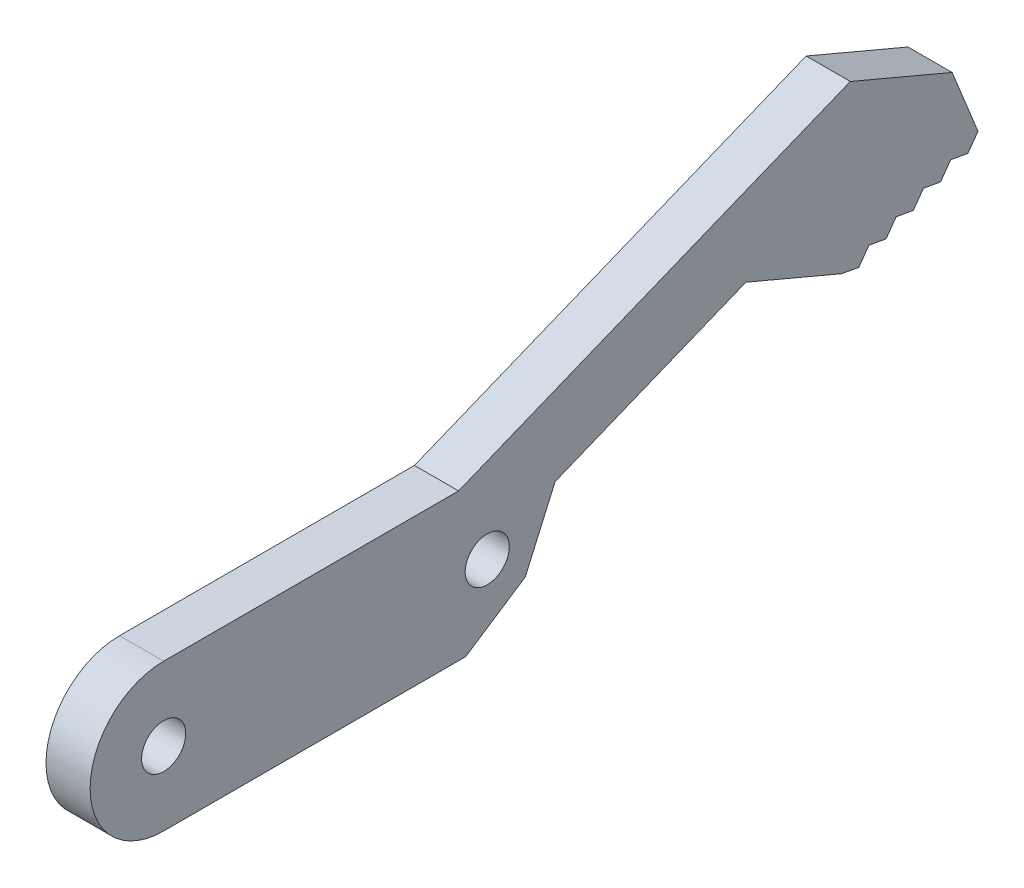
ISO-10303-21;
HEADER;
FILE_DESCRIPTION(('STEP AP214'),'2;1');
FILE_NAME('part.step','',(''),(''),'','','');
FILE_SCHEMA(('AUTOMOTIVE_DESIGN { 1 0 10303 214 1 1 1 1 }'));
ENDSEC;
DATA;
#1=APPLICATION_CONTEXT('core data for automotive mechanical design processes');
#2=APPLICATION_PROTOCOL_DEFINITION('international standard','automotive_design',2000,#1);
#3=PRODUCT_CONTEXT('',#1,'mechanical');
#4=PRODUCT('Part','Part','',(#3));
#5=PRODUCT_RELATED_PRODUCT_CATEGORY('part','',(#4));
#6=PRODUCT_DEFINITION_FORMATION('','',#4);
#7=PRODUCT_DEFINITION_CONTEXT('part definition',#1,'design');
#8=PRODUCT_DEFINITION('design','',#6,#7);
#9=PRODUCT_DEFINITION_SHAPE('','',#8);
#10=(LENGTH_UNIT() NAMED_UNIT(*) SI_UNIT(.MILLI.,.METRE.));
#11=(NAMED_UNIT(*) PLANE_ANGLE_UNIT() SI_UNIT($,.RADIAN.));
#12=(NAMED_UNIT(*) SI_UNIT($,.STERADIAN.) SOLID_ANGLE_UNIT());
#13=UNCERTAINTY_MEASURE_WITH_UNIT(LENGTH_MEASURE(1.E-05),#10,'distance_accuracy_value','');
#14=(GEOMETRIC_REPRESENTATION_CONTEXT(3) GLOBAL_UNCERTAINTY_ASSIGNED_CONTEXT((#13)) GLOBAL_UNIT_ASSIGNED_CONTEXT((#10,
#11,#12)) REPRESENTATION_CONTEXT('',''));
#15=CARTESIAN_POINT('',(0.,0.,0.));
#16=DIRECTION('',(0.,0.,1.));
#17=DIRECTION('',(1.,0.,0.));
#18=AXIS2_PLACEMENT_3D('',#15,#16,#17);
#19=CARTESIAN_POINT('',(2.83333333333333,5.43468723049841,-40.6850552661478));
#20=DIRECTION('',(1.,0.,0.));
#21=DIRECTION('',(0.,0.,-1.));
#22=AXIS2_PLACEMENT_3D('',#19,#20,#21);
#23=PLANE('',#22);
#24=CARTESIAN_POINT('',(2.83333333333333,5.43468723049841,-7.60184241572767));
#25=DIRECTION('',(1.,0.,0.));
#26=DIRECTION('',(0.,0.,-1.));
#27=AXIS2_PLACEMENT_3D('',#24,#25,#26);
#28=CIRCLE('',#27,1.33333333333333);
#29=CARTESIAN_POINT('',(2.83333333333333,5.43468723049841,-8.935175749061));
#30=VERTEX_POINT('',#29);
#31=EDGE_CURVE('E156',#30,#30,#28,.T.);
#32=ORIENTED_EDGE('',*,*,#31,.F.);
#33=EDGE_LOOP('',(#32));
#34=FACE_BOUND('',#33,.T.);
#35=CARTESIAN_POINT('',(2.83333333333333,5.43468723049841,-27.1573979712832));
#36=DIRECTION('',(1.,0.,0.));
#37=DIRECTION('',(0.,0.,-1.));
#38=AXIS2_PLACEMENT_3D('',#35,#36,#37);
#39=CIRCLE('',#38,1.33333333333333);
#40=CARTESIAN_POINT('',(2.83333333333333,5.43468723049841,-28.4907313046166));
#41=VERTEX_POINT('',#40);
#42=EDGE_CURVE('E127',#41,#41,#39,.T.);
#43=ORIENTED_EDGE('',*,*,#42,.F.);
#44=EDGE_LOOP('',(#43));
#45=FACE_BOUND('',#44,.T.);
#46=DIRECTION('',(0.,-0.17631045866029,-0.984334608843455));
#47=VECTOR('',#46,1.);
#48=CARTESIAN_POINT('',(2.83333333333333,21.0126260508792,-6.74373491928631));
#49=LINE('',#48,#47);
#50=CARTESIAN_POINT('',(2.83333333333333,12.339068917895,-55.1678756801447));
#51=VERTEX_POINT('',#50);
#52=CARTESIAN_POINT('',(2.83333333333333,12.1538402465791,-56.20200033226));
#53=VERTEX_POINT('',#52);
#54=EDGE_CURVE('E331',#51,#53,#49,.T.);
#55=ORIENTED_EDGE('',*,*,#54,.T.);
#56=DIRECTION('',(0.,0.811746559900308,-0.58400986506224));
#57=VECTOR('',#56,1.);
#58=CARTESIAN_POINT('',(2.83333333333333,-20.3489651803661,-32.8179049147621));
#59=LINE('',#58,#57);
#60=CARTESIAN_POINT('',(2.83333333333333,13.0066469256504,-56.8155508394895));
#61=VERTEX_POINT('',#60);
#62=EDGE_CURVE('E346',#53,#61,#59,.T.);
#63=ORIENTED_EDGE('',*,*,#62,.T.);
#64=DIRECTION('',(0.,0.926817277131444,0.37551262936239));
#65=VECTOR('',#64,1.);
#66=CARTESIAN_POINT('',(2.83333333333333,21.3594051498293,-53.4313172040337));
#67=LINE('',#66,#65);
#68=CARTESIAN_POINT('',(2.83333333333333,16.8663259864155,-55.2517493563225));
#69=VERTEX_POINT('',#68);
#70=EDGE_CURVE('E90',#61,#69,#67,.T.);
#71=ORIENTED_EDGE('',*,*,#70,.T.);
#72=DIRECTION('',(0.,-0.389831254937164,-0.920886308223831));
#73=VECTOR('',#72,1.);
#74=CARTESIAN_POINT('',(2.83333333333333,33.1550279264657,-16.7734529002086));
#75=LINE('',#74,#73);
#76=CARTESIAN_POINT('',(2.83333333333333,19.4709341667645,-49.098964064754));
#77=VERTEX_POINT('',#76);
#78=EDGE_CURVE('E244',#77,#69,#75,.T.);
#79=ORIENTED_EDGE('',*,*,#78,.F.);
#80=DIRECTION('',(0.,-0.375512629362391,0.926817277131444));
#81=VECTOR('',#80,1.);
#82=CARTESIAN_POINT('',(2.83333333333333,0.875860358598909,-3.20374156796222));
#83=LINE('',#82,#81);
#84=CARTESIAN_POINT('',(2.83333333333333,9.87913167494285,-25.425064512168));
#85=VERTEX_POINT('',#84);
#86=EDGE_CURVE('E212',#77,#85,#83,.T.);
#87=ORIENTED_EDGE('',*,*,#86,.T.);
#88=DIRECTION('',(0.,0.,-1.));
#89=VECTOR('',#88,1.);
#90=CARTESIAN_POINT('',(2.83333333333333,9.87913167494285,-40.6850552661478));
#91=LINE('',#90,#89);
#92=CARTESIAN_POINT('',(2.83333333333333,9.87913167494285,-7.60184241572767));
#93=VERTEX_POINT('',#92);
#94=EDGE_CURVE('E142',#93,#85,#91,.T.);
#95=ORIENTED_EDGE('',*,*,#94,.F.);
#96=CARTESIAN_POINT('',(2.83333333333333,5.43468723049841,-7.60184241572767));
#97=DIRECTION('',(1.,0.,0.));
#98=DIRECTION('',(0.,0.,-1.));
#99=AXIS2_PLACEMENT_3D('',#96,#97,#98);
#100=CIRCLE('',#99,4.44444444444445);
#101=CARTESIAN_POINT('',(2.83333333333333,0.990242786053964,-7.60184241572767));
#102=VERTEX_POINT('',#101);
#103=EDGE_CURVE('E98',#93,#102,#100,.T.);
#104=ORIENTED_EDGE('',*,*,#103,.T.);
#105=DIRECTION('',(0.,0.,-1.));
#106=VECTOR('',#105,1.);
#107=CARTESIAN_POINT('',(2.83333333333333,0.990242786053965,-40.6850552661478));
#108=LINE('',#107,#106);
#109=CARTESIAN_POINT('',(2.83333333333333,0.990242786053965,-25.859209518077));
#110=VERTEX_POINT('',#109);
#111=EDGE_CURVE('E126',#102,#110,#108,.T.);
#112=ORIENTED_EDGE('',*,*,#111,.T.);
#113=DIRECTION('',(0.,-0.55021058417257,0.835025935563968));
#114=VECTOR('',#113,1.);
#115=CARTESIAN_POINT('',(2.83333333333333,-9.43987995839411,-10.0299556773364));
#116=LINE('',#115,#114);
#117=CARTESIAN_POINT('',(2.83333333333333,3.3590176431871,-29.4541756966949));
#118=VERTEX_POINT('',#117);
#119=EDGE_CURVE('E253',#118,#110,#116,.T.);
#120=ORIENTED_EDGE('',*,*,#119,.F.);
#121=DIRECTION('',(0.,-0.914855352080967,0.403781729117119));
#122=VECTOR('',#121,1.);
#123=CARTESIAN_POINT('',(2.83333333333333,-8.33763193129747,-24.2917274699675));
#124=LINE('',#123,#122);
#125=CARTESIAN_POINT('',(2.83333333333333,7.29766662279921,-31.1925428514103));
#126=VERTEX_POINT('',#125);
#127=EDGE_CURVE('E257',#126,#118,#124,.T.);
#128=ORIENTED_EDGE('',*,*,#127,.F.);
#129=DIRECTION('',(0.,-0.920886308223829,0.389831254937168));
#130=VECTOR('',#129,1.);
#131=CARTESIAN_POINT('',(2.83333333333333,-8.11557215428521,-24.6677827790121));
#132=LINE('',#131,#130);
#133=CARTESIAN_POINT('',(2.83333333333333,7.44595371155962,-31.2553160096017));
#134=VERTEX_POINT('',#133);
#135=EDGE_CURVE('E176',#134,#126,#132,.T.);
#136=ORIENTED_EDGE('',*,*,#135,.F.);
#137=DIRECTION('',(0.,0.375512629362391,-0.926817277131444));
#138=VECTOR('',#137,1.);
#139=CARTESIAN_POINT('',(2.83333333333333,-3.24332753976306,-4.87268658735062));
#140=LINE('',#139,#138);
#141=CARTESIAN_POINT('',(2.83333333333333,12.1189997658471,-42.7890421250152));
#142=VERTEX_POINT('',#141);
#143=EDGE_CURVE('E206',#134,#142,#140,.T.);
#144=ORIENTED_EDGE('',*,*,#143,.T.);
#145=DIRECTION('',(0.,-0.389831254937164,-0.920886308223831));
#146=VECTOR('',#145,1.);
#147=CARTESIAN_POINT('',(2.83333333333333,24.6551547367493,-13.1752712324358));
#148=LINE('',#147,#146);
#149=CARTESIAN_POINT('',(2.83333333333333,9.66875688687358,-48.5771750427655));
#150=VERTEX_POINT('',#149);
#151=EDGE_CURVE('E209',#142,#150,#148,.T.);
#152=ORIENTED_EDGE('',*,*,#151,.T.);
#153=DIRECTION('',(0.,-0.176310458660284,-0.984334608843456));
#154=VECTOR('',#153,1.);
#155=CARTESIAN_POINT('',(2.83333333333333,17.2815155586023,-6.07543188869535));
#156=LINE('',#155,#154);
#157=CARTESIAN_POINT('',(2.83333333333333,9.48352821555765,-49.6112996948809));
#158=VERTEX_POINT('',#157);
#159=EDGE_CURVE('E266',#150,#158,#156,.T.);
#160=ORIENTED_EDGE('',*,*,#159,.T.);
#161=DIRECTION('',(0.,0.811746559900305,-0.584009865062245));
#162=VECTOR('',#161,1.);
#163=CARTESIAN_POINT('',(2.83333333333333,-18.1352816264707,-29.7409876962642));
#164=LINE('',#163,#162);
#165=CARTESIAN_POINT('',(2.83333333333333,10.3363348946289,-50.2248502021103));
#166=VERTEX_POINT('',#165);
#167=EDGE_CURVE('E277',#158,#166,#164,.T.);
#168=ORIENTED_EDGE('',*,*,#167,.T.);
#169=DIRECTION('',(0.,-0.176310458660287,-0.984334608843456));
#170=VECTOR('',#169,1.);
#171=CARTESIAN_POINT('',(2.83333333333333,18.2142931816716,-6.24250764634311));
#172=LINE('',#171,#170);
#173=CARTESIAN_POINT('',(2.83333333333333,10.151106223313,-51.2589748542256));
#174=VERTEX_POINT('',#173);
#175=EDGE_CURVE('E284',#166,#174,#172,.T.);
#176=ORIENTED_EDGE('',*,*,#175,.T.);
#177=DIRECTION('',(0.,0.811746559900305,-0.584009865062244));
#178=VECTOR('',#177,1.);
#179=CARTESIAN_POINT('',(2.83333333333333,-18.6887025149446,-30.5102170008886));
#180=LINE('',#179,#178);
#181=CARTESIAN_POINT('',(2.83333333333333,11.0039129023843,-51.8725253614551));
#182=VERTEX_POINT('',#181);
#183=EDGE_CURVE('E281',#174,#182,#180,.T.);
#184=ORIENTED_EDGE('',*,*,#183,.T.);
#185=DIRECTION('',(0.,-0.176310458660285,-0.984334608843456));
#186=VECTOR('',#185,1.);
#187=CARTESIAN_POINT('',(2.83333333333333,19.1470708047407,-6.40958340399077));
#188=LINE('',#187,#186);
#189=CARTESIAN_POINT('',(2.83333333333333,10.8186842310684,-52.9066500135704));
#190=VERTEX_POINT('',#189);
#191=EDGE_CURVE('E296',#182,#190,#188,.T.);
#192=ORIENTED_EDGE('',*,*,#191,.T.);
#193=DIRECTION('',(0.,0.811746559900305,-0.584009865062245));
#194=VECTOR('',#193,1.);
#195=CARTESIAN_POINT('',(2.83333333333333,-19.2421234034184,-31.279446305513));
#196=LINE('',#195,#194);
#197=CARTESIAN_POINT('',(2.83333333333333,11.6714909101397,-53.5202005207999));
#198=VERTEX_POINT('',#197);
#199=EDGE_CURVE('E295',#190,#198,#196,.T.);
#200=ORIENTED_EDGE('',*,*,#199,.T.);
#201=DIRECTION('',(0.,-0.176310458660293,-0.984334608843455));
#202=VECTOR('',#201,1.);
#203=CARTESIAN_POINT('',(2.83333333333333,20.0798484278102,-6.57665916163869));
#204=LINE('',#203,#202);
#205=CARTESIAN_POINT('',(2.83333333333333,11.4862622388237,-54.5543251729152));
#206=VERTEX_POINT('',#205);
#207=EDGE_CURVE('E314',#198,#206,#204,.T.);
#208=ORIENTED_EDGE('',*,*,#207,.T.);
#209=DIRECTION('',(0.,0.811746559900307,-0.584009865062241));
#210=VECTOR('',#209,1.);
#211=CARTESIAN_POINT('',(2.83333333333333,-19.7955442918922,-32.0486756101376));
#212=LINE('',#211,#210);
#213=EDGE_CURVE('E313',#206,#51,#212,.T.);
#214=ORIENTED_EDGE('',*,*,#213,.T.);
#215=EDGE_LOOP('',(#55,#63,#71,#79,#87,#95,#104,#112,#120,#128,#136,#144,#152,#160,#168,#176,
#184,#192,#200,#208,#214));
#216=FACE_BOUND('',#215,.T.);
#217=ADVANCED_FACE('F75',(#34,#45,#216),#23,.T.);
#218=CARTESIAN_POINT('',(0.166666666666667,5.43468723049841,-40.6850552661478));
#219=DIRECTION('',(1.,0.,0.));
#220=DIRECTION('',(0.,0.,-1.));
#221=AXIS2_PLACEMENT_3D('',#218,#219,#220);
#222=PLANE('',#221);
#223=CARTESIAN_POINT('',(0.166666666666667,5.43468723049841,-7.60184241572767));
#224=DIRECTION('',(1.,0.,0.));
#225=DIRECTION('',(0.,0.,-1.));
#226=AXIS2_PLACEMENT_3D('',#223,#224,#225);
#227=CIRCLE('',#226,1.33333333333333);
#228=CARTESIAN_POINT('',(0.166666666666667,5.43468723049841,-8.935175749061));
#229=VERTEX_POINT('',#228);
#230=EDGE_CURVE('E134',#229,#229,#227,.T.);
#231=ORIENTED_EDGE('',*,*,#230,.T.);
#232=EDGE_LOOP('',(#231));
#233=FACE_BOUND('',#232,.T.);
#234=CARTESIAN_POINT('',(0.166666666666667,5.43468723049841,-27.1573979712832));
#235=DIRECTION('',(1.,0.,0.));
#236=DIRECTION('',(0.,0.,-1.));
#237=AXIS2_PLACEMENT_3D('',#234,#235,#236);
#238=CIRCLE('',#237,1.33333333333333);
#239=CARTESIAN_POINT('',(0.166666666666667,5.43468723049841,-28.4907313046166));
#240=VERTEX_POINT('',#239);
#241=EDGE_CURVE('E137',#240,#240,#238,.T.);
#242=ORIENTED_EDGE('',*,*,#241,.T.);
#243=EDGE_LOOP('',(#242));
#244=FACE_BOUND('',#243,.T.);
#245=DIRECTION('',(0.,-0.811746559900308,0.58400986506224));
#246=VECTOR('',#245,1.);
#247=CARTESIAN_POINT('',(0.166666666666667,-20.3489651803661,-32.8179049147621));
#248=LINE('',#247,#246);
#249=CARTESIAN_POINT('',(0.166666666666667,13.0066469256504,-56.8155508394895));
#250=VERTEX_POINT('',#249);
#251=CARTESIAN_POINT('',(0.166666666666667,12.1538402465791,-56.20200033226));
#252=VERTEX_POINT('',#251);
#253=EDGE_CURVE('E344',#250,#252,#248,.T.);
#254=ORIENTED_EDGE('',*,*,#253,.T.);
#255=DIRECTION('',(0.,0.17631045866029,0.984334608843455));
#256=VECTOR('',#255,1.);
#257=CARTESIAN_POINT('',(0.166666666666667,21.0126260508792,-6.74373491928631));
#258=LINE('',#257,#256);
#259=CARTESIAN_POINT('',(0.166666666666667,12.339068917895,-55.1678756801447));
#260=VERTEX_POINT('',#259);
#261=EDGE_CURVE('E327',#252,#260,#258,.T.);
#262=ORIENTED_EDGE('',*,*,#261,.T.);
#263=DIRECTION('',(0.,-0.811746559900307,0.584009865062241));
#264=VECTOR('',#263,1.);
#265=CARTESIAN_POINT('',(0.166666666666667,-19.7955442918922,-32.0486756101376));
#266=LINE('',#265,#264);
#267=CARTESIAN_POINT('',(0.166666666666667,11.4862622388237,-54.5543251729152));
#268=VERTEX_POINT('',#267);
#269=EDGE_CURVE('E337',#260,#268,#266,.T.);
#270=ORIENTED_EDGE('',*,*,#269,.T.);
#271=DIRECTION('',(0.,0.176310458660293,0.984334608843455));
#272=VECTOR('',#271,1.);
#273=CARTESIAN_POINT('',(0.166666666666667,20.0798484278102,-6.57665916163869));
#274=LINE('',#273,#272);
#275=CARTESIAN_POINT('',(0.166666666666667,11.6714909101397,-53.5202005207999));
#276=VERTEX_POINT('',#275);
#277=EDGE_CURVE('E309',#268,#276,#274,.T.);
#278=ORIENTED_EDGE('',*,*,#277,.T.);
#279=DIRECTION('',(0.,-0.811746559900304,0.584009865062245));
#280=VECTOR('',#279,1.);
#281=CARTESIAN_POINT('',(0.166666666666667,-19.2421234034184,-31.279446305513));
#282=LINE('',#281,#280);
#283=CARTESIAN_POINT('',(0.166666666666667,10.8186842310684,-52.9066500135704));
#284=VERTEX_POINT('',#283);
#285=EDGE_CURVE('E320',#276,#284,#282,.T.);
#286=ORIENTED_EDGE('',*,*,#285,.T.);
#287=DIRECTION('',(0.,0.176310458660285,0.984334608843456));
#288=VECTOR('',#287,1.);
#289=CARTESIAN_POINT('',(0.166666666666667,19.1470708047407,-6.40958340399077));
#290=LINE('',#289,#288);
#291=CARTESIAN_POINT('',(0.166666666666667,11.0039129023843,-51.8725253614551));
#292=VERTEX_POINT('',#291);
#293=EDGE_CURVE('E291',#284,#292,#290,.T.);
#294=ORIENTED_EDGE('',*,*,#293,.T.);
#295=DIRECTION('',(0.,-0.811746559900305,0.584009865062244));
#296=VECTOR('',#295,1.);
#297=CARTESIAN_POINT('',(0.166666666666667,-18.6887025149446,-30.5102170008886));
#298=LINE('',#297,#296);
#299=CARTESIAN_POINT('',(0.166666666666667,10.151106223313,-51.2589748542256));
#300=VERTEX_POINT('',#299);
#301=EDGE_CURVE('E302',#292,#300,#298,.T.);
#302=ORIENTED_EDGE('',*,*,#301,.T.);
#303=DIRECTION('',(0.,0.176310458660287,0.984334608843456));
#304=VECTOR('',#303,1.);
#305=CARTESIAN_POINT('',(0.166666666666667,18.2142931816716,-6.24250764634311));
#306=LINE('',#305,#304);
#307=CARTESIAN_POINT('',(0.166666666666667,10.3363348946289,-50.2248502021103));
#308=VERTEX_POINT('',#307);
#309=EDGE_CURVE('E273',#300,#308,#306,.T.);
#310=ORIENTED_EDGE('',*,*,#309,.T.);
#311=DIRECTION('',(0.,-0.811746559900305,0.584009865062245));
#312=VECTOR('',#311,1.);
#313=CARTESIAN_POINT('',(0.166666666666667,-18.1352816264707,-29.7409876962642));
#314=LINE('',#313,#312);
#315=CARTESIAN_POINT('',(0.166666666666667,9.48352821555765,-49.6112996948809));
#316=VERTEX_POINT('',#315);
#317=EDGE_CURVE('E278',#308,#316,#314,.T.);
#318=ORIENTED_EDGE('',*,*,#317,.T.);
#319=DIRECTION('',(0.,0.176310458660284,0.984334608843456));
#320=VECTOR('',#319,1.);
#321=CARTESIAN_POINT('',(0.166666666666667,17.2815155586023,-6.07543188869535));
#322=LINE('',#321,#320);
#323=CARTESIAN_POINT('',(0.166666666666667,9.66875688687358,-48.5771750427655));
#324=VERTEX_POINT('',#323);
#325=EDGE_CURVE('E269',#316,#324,#322,.T.);
#326=ORIENTED_EDGE('',*,*,#325,.T.);
#327=DIRECTION('',(0.,-0.389831254937164,-0.920886308223831));
#328=VECTOR('',#327,1.);
#329=CARTESIAN_POINT('',(0.166666666666667,24.6551547367493,-13.1752712324358));
#330=LINE('',#329,#328);
#331=CARTESIAN_POINT('',(0.166666666666667,12.1189997658471,-42.7890421250152));
#332=VERTEX_POINT('',#331);
#333=EDGE_CURVE('E217',#332,#324,#330,.T.);
#334=ORIENTED_EDGE('',*,*,#333,.F.);
#335=DIRECTION('',(0.,0.375512629362391,-0.926817277131444));
#336=VECTOR('',#335,1.);
#337=CARTESIAN_POINT('',(0.166666666666667,-3.24332753976306,-4.87268658735062));
#338=LINE('',#337,#336);
#339=CARTESIAN_POINT('',(0.166666666666667,7.44595371155962,-31.2553160096017));
#340=VERTEX_POINT('',#339);
#341=EDGE_CURVE('E215',#340,#332,#338,.T.);
#342=ORIENTED_EDGE('',*,*,#341,.F.);
#343=DIRECTION('',(0.,-0.920886308223829,0.389831254937168));
#344=VECTOR('',#343,1.);
#345=CARTESIAN_POINT('',(0.166666666666667,-8.11557215428521,-24.6677827790121));
#346=LINE('',#345,#344);
#347=CARTESIAN_POINT('',(0.166666666666667,7.29766662279921,-31.1925428514103));
#348=VERTEX_POINT('',#347);
#349=EDGE_CURVE('E189',#340,#348,#346,.T.);
#350=ORIENTED_EDGE('',*,*,#349,.T.);
#351=DIRECTION('',(0.,0.914855352080967,-0.40378172911712));
#352=VECTOR('',#351,1.);
#353=CARTESIAN_POINT('',(0.166666666666667,-8.33763193129747,-24.2917274699675));
#354=LINE('',#353,#352);
#355=CARTESIAN_POINT('',(0.166666666666667,3.3590176431871,-29.4541756966949));
#356=VERTEX_POINT('',#355);
#357=EDGE_CURVE('E260',#356,#348,#354,.T.);
#358=ORIENTED_EDGE('',*,*,#357,.F.);
#359=DIRECTION('',(0.,0.55021058417257,-0.835025935563968));
#360=VECTOR('',#359,1.);
#361=CARTESIAN_POINT('',(0.166666666666667,-9.43987995839411,-10.0299556773364));
#362=LINE('',#361,#360);
#363=CARTESIAN_POINT('',(0.166666666666667,0.990242786053965,-25.859209518077));
#364=VERTEX_POINT('',#363);
#365=EDGE_CURVE('E133',#364,#356,#362,.T.);
#366=ORIENTED_EDGE('',*,*,#365,.F.);
#367=DIRECTION('',(0.,0.,-1.));
#368=VECTOR('',#367,1.);
#369=CARTESIAN_POINT('',(0.166666666666667,0.990242786053965,-40.6850552661478));
#370=LINE('',#369,#368);
#371=CARTESIAN_POINT('',(0.166666666666667,0.990242786053964,-7.60184241572767));
#372=VERTEX_POINT('',#371);
#373=EDGE_CURVE('E118',#372,#364,#370,.T.);
#374=ORIENTED_EDGE('',*,*,#373,.F.);
#375=CARTESIAN_POINT('',(0.166666666666667,5.43468723049841,-7.60184241572767));
#376=DIRECTION('',(1.,0.,0.));
#377=DIRECTION('',(0.,0.,-1.));
#378=AXIS2_PLACEMENT_3D('',#375,#376,#377);
#379=CIRCLE('',#378,4.44444444444445);
#380=CARTESIAN_POINT('',(0.166666666666667,9.87913167494285,-7.60184241572767));
#381=VERTEX_POINT('',#380);
#382=EDGE_CURVE('E110',#381,#372,#379,.T.);
#383=ORIENTED_EDGE('',*,*,#382,.F.);
#384=DIRECTION('',(0.,0.,-1.));
#385=VECTOR('',#384,1.);
#386=CARTESIAN_POINT('',(0.166666666666667,9.87913167494285,-40.6850552661478));
#387=LINE('',#386,#385);
#388=CARTESIAN_POINT('',(0.166666666666667,9.87913167494285,-25.425064512168));
#389=VERTEX_POINT('',#388);
#390=EDGE_CURVE('E119',#381,#389,#387,.T.);
#391=ORIENTED_EDGE('',*,*,#390,.T.);
#392=DIRECTION('',(0.,-0.375512629362391,0.926817277131444));
#393=VECTOR('',#392,1.);
#394=CARTESIAN_POINT('',(0.166666666666667,0.875860358598909,-3.20374156796222));
#395=LINE('',#394,#393);
#396=CARTESIAN_POINT('',(0.166666666666667,19.4709341667645,-49.098964064754));
#397=VERTEX_POINT('',#396);
#398=EDGE_CURVE('E196',#397,#389,#395,.T.);
#399=ORIENTED_EDGE('',*,*,#398,.F.);
#400=DIRECTION('',(0.,-0.389831254937164,-0.920886308223831));
#401=VECTOR('',#400,1.);
#402=CARTESIAN_POINT('',(0.166666666666667,33.1550279264657,-16.7734529002086));
#403=LINE('',#402,#401);
#404=CARTESIAN_POINT('',(0.166666666666667,16.8663259864155,-55.2517493563225));
#405=VERTEX_POINT('',#404);
#406=EDGE_CURVE('E242',#397,#405,#403,.T.);
#407=ORIENTED_EDGE('',*,*,#406,.T.);
#408=DIRECTION('',(0.,0.926817277131444,0.37551262936239));
#409=VECTOR('',#408,1.);
#410=CARTESIAN_POINT('',(0.166666666666667,21.3594051498293,-53.4313172040337));
#411=LINE('',#410,#409);
#412=EDGE_CURVE('E202',#250,#405,#411,.T.);
#413=ORIENTED_EDGE('',*,*,#412,.F.);
#414=EDGE_LOOP('',(#254,#262,#270,#278,#286,#294,#302,#310,#318,#326,#334,#342,#350,#358,#366,
#374,#383,#391,#399,#407,#413));
#415=FACE_BOUND('',#414,.T.);
#416=ADVANCED_FACE('F130',(#233,#244,#415),#222,.F.);
#417=CARTESIAN_POINT('',(0.166666666666667,21.3594051498293,-53.4313172040337));
#418=DIRECTION('',(0.,0.37551262936239,-0.926817277131444));
#419=DIRECTION('',(0.,0.926817277131444,0.37551262936239));
#420=AXIS2_PLACEMENT_3D('',#417,#418,#419);
#421=PLANE('',#420);
#422=ORIENTED_EDGE('',*,*,#70,.F.);
#423=DIRECTION('',(1.,0.,0.));
#424=VECTOR('',#423,1.);
#425=CARTESIAN_POINT('',(0.165777777777778,13.0066469256504,-56.8155508394895));
#426=LINE('',#425,#424);
#427=EDGE_CURVE('E234',#250,#61,#426,.T.);
#428=ORIENTED_EDGE('',*,*,#427,.F.);
#429=ORIENTED_EDGE('',*,*,#412,.T.);
#430=DIRECTION('',(1.,0.,0.));
#431=VECTOR('',#430,1.);
#432=CARTESIAN_POINT('',(0.166666666666667,16.8663259864155,-55.2517493563225));
#433=LINE('',#432,#431);
#434=EDGE_CURVE('E210',#405,#69,#433,.T.);
#435=ORIENTED_EDGE('',*,*,#434,.T.);
#436=EDGE_LOOP('',(#422,#428,#429,#435));
#437=FACE_BOUND('',#436,.T.);
#438=ADVANCED_FACE('F231',(#437),#421,.T.);
#439=CARTESIAN_POINT('',(2.83333333333333,9.87913167494285,-40.6850552661478));
#440=DIRECTION('',(0.,1.,0.));
#441=DIRECTION('',(0.,0.,1.));
#442=AXIS2_PLACEMENT_3D('',#439,#440,#441);
#443=PLANE('',#442);
#444=DIRECTION('',(1.,0.,0.));
#445=VECTOR('',#444,1.);
#446=CARTESIAN_POINT('',(0.166666666666667,9.87913167494285,-25.425064512168));
#447=LINE('',#446,#445);
#448=EDGE_CURVE('E173',#389,#85,#447,.T.);
#449=ORIENTED_EDGE('',*,*,#448,.F.);
#450=ORIENTED_EDGE('',*,*,#390,.F.);
#451=DIRECTION('',(-1.,0.,0.));
#452=VECTOR('',#451,1.);
#453=CARTESIAN_POINT('',(2.83333333333333,9.87913167494285,-7.60184241572767));
#454=LINE('',#453,#452);
#455=EDGE_CURVE('E12',#93,#381,#454,.T.);
#456=ORIENTED_EDGE('',*,*,#455,.F.);
#457=ORIENTED_EDGE('',*,*,#94,.T.);
#458=EDGE_LOOP('',(#449,#450,#456,#457));
#459=FACE_BOUND('',#458,.T.);
#460=ADVANCED_FACE('F77',(#459),#443,.T.);
#461=CARTESIAN_POINT('',(2.83333333333333,5.43468723049841,-7.60184241572767));
#462=DIRECTION('',(-1.,0.,0.));
#463=DIRECTION('',(0.,0.,1.));
#464=AXIS2_PLACEMENT_3D('',#461,#462,#463);
#465=CYLINDRICAL_SURFACE('',#464,4.44444444444445);
#466=ORIENTED_EDGE('',*,*,#382,.T.);
#467=DIRECTION('',(-1.,0.,0.));
#468=VECTOR('',#467,1.);
#469=CARTESIAN_POINT('',(2.83333333333333,0.990242786053964,-7.60184241572767));
#470=LINE('',#469,#468);
#471=EDGE_CURVE('E83',#102,#372,#470,.T.);
#472=ORIENTED_EDGE('',*,*,#471,.F.);
#473=ORIENTED_EDGE('',*,*,#103,.F.);
#474=ORIENTED_EDGE('',*,*,#455,.T.);
#475=EDGE_LOOP('',(#466,#472,#473,#474));
#476=FACE_BOUND('',#475,.T.);
#477=ADVANCED_FACE('F112',(#476),#465,.T.);
#478=CARTESIAN_POINT('',(2.83333333333333,0.990242786053965,-40.6850552661478));
#479=DIRECTION('',(0.,1.,0.));
#480=DIRECTION('',(0.,0.,1.));
#481=AXIS2_PLACEMENT_3D('',#478,#479,#480);
#482=PLANE('',#481);
#483=ORIENTED_EDGE('',*,*,#373,.T.);
#484=DIRECTION('',(1.,0.,0.));
#485=VECTOR('',#484,1.);
#486=CARTESIAN_POINT('',(0.165777777777778,0.990242786053965,-25.859209518077));
#487=LINE('',#486,#485);
#488=EDGE_CURVE('E249',#364,#110,#487,.T.);
#489=ORIENTED_EDGE('',*,*,#488,.T.);
#490=ORIENTED_EDGE('',*,*,#111,.F.);
#491=ORIENTED_EDGE('',*,*,#471,.T.);
#492=EDGE_LOOP('',(#483,#489,#490,#491));
#493=FACE_BOUND('',#492,.T.);
#494=ADVANCED_FACE('F123',(#493),#482,.F.);
#495=CARTESIAN_POINT('',(2.83333333333333,5.43468723049841,-7.60184241572767));
#496=DIRECTION('',(-1.,0.,0.));
#497=DIRECTION('',(0.,0.,1.));
#498=AXIS2_PLACEMENT_3D('',#495,#496,#497);
#499=CYLINDRICAL_SURFACE('',#498,1.33333333333333);
#500=ORIENTED_EDGE('',*,*,#31,.T.);
#501=EDGE_LOOP('',(#500));
#502=FACE_BOUND('',#501,.T.);
#503=ORIENTED_EDGE('',*,*,#230,.F.);
#504=EDGE_LOOP('',(#503));
#505=FACE_BOUND('',#504,.T.);
#506=ADVANCED_FACE('F486',(#502,#505),#499,.F.);
#507=CARTESIAN_POINT('',(2.83333333333333,5.43468723049841,-27.1573979712832));
#508=DIRECTION('',(-1.,0.,0.));
#509=DIRECTION('',(0.,0.,1.));
#510=AXIS2_PLACEMENT_3D('',#507,#508,#509);
#511=CYLINDRICAL_SURFACE('',#510,1.33333333333333);
#512=ORIENTED_EDGE('',*,*,#42,.T.);
#513=EDGE_LOOP('',(#512));
#514=FACE_BOUND('',#513,.T.);
#515=ORIENTED_EDGE('',*,*,#241,.F.);
#516=EDGE_LOOP('',(#515));
#517=FACE_BOUND('',#516,.T.);
#518=ADVANCED_FACE('F483',(#514,#517),#511,.F.);
#519=CARTESIAN_POINT('',(0.166666666666667,-3.24332753976306,-4.87268658735062));
#520=DIRECTION('',(0.,-0.926817277131444,-0.375512629362391));
#521=DIRECTION('',(0.,0.375512629362391,-0.926817277131444));
#522=AXIS2_PLACEMENT_3D('',#519,#520,#521);
#523=PLANE('',#522);
#524=ORIENTED_EDGE('',*,*,#143,.F.);
#525=DIRECTION('',(1.,0.,0.));
#526=VECTOR('',#525,1.);
#527=CARTESIAN_POINT('',(0.166666666666667,7.44595371155962,-31.2553160096017));
#528=LINE('',#527,#526);
#529=EDGE_CURVE('E160',#340,#134,#528,.T.);
#530=ORIENTED_EDGE('',*,*,#529,.F.);
#531=ORIENTED_EDGE('',*,*,#341,.T.);
#532=DIRECTION('',(1.,0.,0.));
#533=VECTOR('',#532,1.);
#534=CARTESIAN_POINT('',(0.166666666666667,12.1189997658471,-42.7890421250152));
#535=LINE('',#534,#533);
#536=EDGE_CURVE('E152',#332,#142,#535,.T.);
#537=ORIENTED_EDGE('',*,*,#536,.T.);
#538=EDGE_LOOP('',(#524,#530,#531,#537));
#539=FACE_BOUND('',#538,.T.);
#540=ADVANCED_FACE('F480',(#539),#523,.T.);
#541=CARTESIAN_POINT('',(0.166666666666667,-8.11557215428521,-24.6677827790121));
#542=DIRECTION('',(0.,0.389831254937168,0.920886308223829));
#543=DIRECTION('',(0.,-0.920886308223829,0.389831254937168));
#544=AXIS2_PLACEMENT_3D('',#541,#542,#543);
#545=PLANE('',#544);
#546=ORIENTED_EDGE('',*,*,#135,.T.);
#547=DIRECTION('',(1.,0.,0.));
#548=VECTOR('',#547,1.);
#549=CARTESIAN_POINT('',(0.166666666666667,7.29766662279921,-31.1925428514103));
#550=LINE('',#549,#548);
#551=EDGE_CURVE('E164',#348,#126,#550,.T.);
#552=ORIENTED_EDGE('',*,*,#551,.F.);
#553=ORIENTED_EDGE('',*,*,#349,.F.);
#554=ORIENTED_EDGE('',*,*,#529,.T.);
#555=EDGE_LOOP('',(#546,#552,#553,#554));
#556=FACE_BOUND('',#555,.T.);
#557=ADVANCED_FACE('F503',(#556),#545,.F.);
#558=CARTESIAN_POINT('',(0.166666666666667,0.875860358598909,-3.20374156796222));
#559=DIRECTION('',(0.,0.926817277131444,0.375512629362391));
#560=DIRECTION('',(0.,-0.375512629362391,0.926817277131444));
#561=AXIS2_PLACEMENT_3D('',#558,#559,#560);
#562=PLANE('',#561);
#563=DIRECTION('',(1.,0.,0.));
#564=VECTOR('',#563,1.);
#565=CARTESIAN_POINT('',(0.166666666666667,19.4709341667645,-49.098964064754));
#566=LINE('',#565,#564);
#567=EDGE_CURVE('E222',#397,#77,#566,.T.);
#568=ORIENTED_EDGE('',*,*,#567,.F.);
#569=ORIENTED_EDGE('',*,*,#398,.T.);
#570=ORIENTED_EDGE('',*,*,#448,.T.);
#571=ORIENTED_EDGE('',*,*,#86,.F.);
#572=EDGE_LOOP('',(#568,#569,#570,#571));
#573=FACE_BOUND('',#572,.T.);
#574=ADVANCED_FACE('F501',(#573),#562,.T.);
#575=CARTESIAN_POINT('',(0.166666666666667,24.6551547367493,-13.1752712324358));
#576=DIRECTION('',(0.,-0.920886308223831,0.389831254937164));
#577=DIRECTION('',(0.,-0.389831254937164,-0.920886308223831));
#578=AXIS2_PLACEMENT_3D('',#575,#576,#577);
#579=PLANE('',#578);
#580=ORIENTED_EDGE('',*,*,#151,.F.);
#581=ORIENTED_EDGE('',*,*,#536,.F.);
#582=ORIENTED_EDGE('',*,*,#333,.T.);
#583=DIRECTION('',(1.,0.,0.));
#584=VECTOR('',#583,1.);
#585=CARTESIAN_POINT('',(0.166666666666667,9.66875688687358,-48.5771750427655));
#586=LINE('',#585,#584);
#587=EDGE_CURVE('E180',#324,#150,#586,.T.);
#588=ORIENTED_EDGE('',*,*,#587,.T.);
#589=EDGE_LOOP('',(#580,#581,#582,#588));
#590=FACE_BOUND('',#589,.T.);
#591=ADVANCED_FACE('F434',(#590),#579,.T.);
#592=CARTESIAN_POINT('',(0.166666666666667,33.1550279264657,-16.7734529002086));
#593=DIRECTION('',(0.,-0.920886308223831,0.389831254937164));
#594=DIRECTION('',(0.,-0.389831254937164,-0.920886308223831));
#595=AXIS2_PLACEMENT_3D('',#592,#593,#594);
#596=PLANE('',#595);
#597=ORIENTED_EDGE('',*,*,#78,.T.);
#598=ORIENTED_EDGE('',*,*,#434,.F.);
#599=ORIENTED_EDGE('',*,*,#406,.F.);
#600=ORIENTED_EDGE('',*,*,#567,.T.);
#601=EDGE_LOOP('',(#597,#598,#599,#600));
#602=FACE_BOUND('',#601,.T.);
#603=ADVANCED_FACE('F240',(#602),#596,.F.);
#604=CARTESIAN_POINT('',(0.165777777777778,-8.33763193129747,-24.2917274699675));
#605=DIRECTION('',(0.,0.403781729117119,0.914855352080966));
#606=DIRECTION('',(0.,-0.914855352080967,0.40378172911712));
#607=AXIS2_PLACEMENT_3D('',#604,#605,#606);
#608=PLANE('',#607);
#609=ORIENTED_EDGE('',*,*,#357,.T.);
#610=ORIENTED_EDGE('',*,*,#551,.T.);
#611=ORIENTED_EDGE('',*,*,#127,.T.);
#612=DIRECTION('',(1.,0.,0.));
#613=VECTOR('',#612,1.);
#614=CARTESIAN_POINT('',(0.165777777777778,3.3590176431871,-29.4541756966949));
#615=LINE('',#614,#613);
#616=EDGE_CURVE('E250',#356,#118,#615,.T.);
#617=ORIENTED_EDGE('',*,*,#616,.F.);
#618=EDGE_LOOP('',(#609,#610,#611,#617));
#619=FACE_BOUND('',#618,.T.);
#620=ADVANCED_FACE('F513',(#619),#608,.F.);
#621=CARTESIAN_POINT('',(0.165777777777778,-9.43987995839411,-10.0299556773364));
#622=DIRECTION('',(0.,0.835025935563968,0.55021058417257));
#623=DIRECTION('',(0.,-0.55021058417257,0.835025935563968));
#624=AXIS2_PLACEMENT_3D('',#621,#622,#623);
#625=PLANE('',#624);
#626=ORIENTED_EDGE('',*,*,#365,.T.);
#627=ORIENTED_EDGE('',*,*,#616,.T.);
#628=ORIENTED_EDGE('',*,*,#119,.T.);
#629=ORIENTED_EDGE('',*,*,#488,.F.);
#630=EDGE_LOOP('',(#626,#627,#628,#629));
#631=FACE_BOUND('',#630,.T.);
#632=ADVANCED_FACE('F516',(#631),#625,.F.);
#633=CARTESIAN_POINT('',(0.165777777777778,17.2815155586023,-6.07543188869535));
#634=DIRECTION('',(0.,-0.984334608843456,0.176310458660284));
#635=DIRECTION('',(0.,-0.176310458660284,-0.984334608843456));
#636=AXIS2_PLACEMENT_3D('',#633,#634,#635);
#637=PLANE('',#636);
#638=DIRECTION('',(1.,0.,0.));
#639=VECTOR('',#638,1.);
#640=CARTESIAN_POINT('',(0.165777777777778,9.48352821555765,-49.6112996948809));
#641=LINE('',#640,#639);
#642=EDGE_CURVE('E263',#316,#158,#641,.T.);
#643=ORIENTED_EDGE('',*,*,#642,.T.);
#644=ORIENTED_EDGE('',*,*,#159,.F.);
#645=ORIENTED_EDGE('',*,*,#587,.F.);
#646=ORIENTED_EDGE('',*,*,#325,.F.);
#647=EDGE_LOOP('',(#643,#644,#645,#646));
#648=FACE_BOUND('',#647,.T.);
#649=ADVANCED_FACE('F432',(#648),#637,.T.);
#650=CARTESIAN_POINT('',(0.165777777777778,-18.1352816264707,-29.7409876962642));
#651=DIRECTION('',(0.,-0.584009865062245,-0.811746559900305));
#652=DIRECTION('',(0.,0.811746559900305,-0.584009865062245));
#653=AXIS2_PLACEMENT_3D('',#650,#651,#652);
#654=PLANE('',#653);
#655=DIRECTION('',(1.,0.,0.));
#656=VECTOR('',#655,1.);
#657=CARTESIAN_POINT('',(0.165777777777778,10.3363348946289,-50.2248502021103));
#658=LINE('',#657,#656);
#659=EDGE_CURVE('E276',#308,#166,#658,.T.);
#660=ORIENTED_EDGE('',*,*,#659,.T.);
#661=ORIENTED_EDGE('',*,*,#167,.F.);
#662=ORIENTED_EDGE('',*,*,#642,.F.);
#663=ORIENTED_EDGE('',*,*,#317,.F.);
#664=EDGE_LOOP('',(#660,#661,#662,#663));
#665=FACE_BOUND('',#664,.T.);
#666=ADVANCED_FACE('F439',(#665),#654,.T.);
#667=CARTESIAN_POINT('',(0.165777777777778,18.2142931816716,-6.24250764634311));
#668=DIRECTION('',(0.,-0.984334608843456,0.176310458660287));
#669=DIRECTION('',(0.,-0.176310458660287,-0.984334608843456));
#670=AXIS2_PLACEMENT_3D('',#667,#668,#669);
#671=PLANE('',#670);
#672=DIRECTION('',(1.,0.,0.));
#673=VECTOR('',#672,1.);
#674=CARTESIAN_POINT('',(0.165777777777778,10.151106223313,-51.2589748542256));
#675=LINE('',#674,#673);
#676=EDGE_CURVE('E272',#300,#174,#675,.T.);
#677=ORIENTED_EDGE('',*,*,#676,.T.);
#678=ORIENTED_EDGE('',*,*,#175,.F.);
#679=ORIENTED_EDGE('',*,*,#659,.F.);
#680=ORIENTED_EDGE('',*,*,#309,.F.);
#681=EDGE_LOOP('',(#677,#678,#679,#680));
#682=FACE_BOUND('',#681,.T.);
#683=ADVANCED_FACE('F442',(#682),#671,.T.);
#684=CARTESIAN_POINT('',(0.165777777777778,19.1470708047407,-6.40958340399077));
#685=DIRECTION('',(0.,-0.984334608843456,0.176310458660285));
#686=DIRECTION('',(0.,-0.176310458660285,-0.984334608843456));
#687=AXIS2_PLACEMENT_3D('',#684,#685,#686);
#688=PLANE('',#687);
#689=DIRECTION('',(1.,0.,0.));
#690=VECTOR('',#689,1.);
#691=CARTESIAN_POINT('',(0.165777777777778,10.8186842310684,-52.9066500135704));
#692=LINE('',#691,#690);
#693=EDGE_CURVE('E299',#284,#190,#692,.T.);
#694=ORIENTED_EDGE('',*,*,#693,.T.);
#695=ORIENTED_EDGE('',*,*,#191,.F.);
#696=DIRECTION('',(1.,0.,0.));
#697=VECTOR('',#696,1.);
#698=CARTESIAN_POINT('',(0.165777777777778,11.0039129023843,-51.8725253614551));
#699=LINE('',#698,#697);
#700=EDGE_CURVE('E294',#292,#182,#699,.T.);
#701=ORIENTED_EDGE('',*,*,#700,.F.);
#702=ORIENTED_EDGE('',*,*,#293,.F.);
#703=EDGE_LOOP('',(#694,#695,#701,#702));
#704=FACE_BOUND('',#703,.T.);
#705=ADVANCED_FACE('F449',(#704),#688,.T.);
#706=CARTESIAN_POINT('',(0.165777777777778,-18.6887025149446,-30.5102170008886));
#707=DIRECTION('',(0.,-0.584009865062244,-0.811746559900305));
#708=DIRECTION('',(0.,0.811746559900305,-0.584009865062244));
#709=AXIS2_PLACEMENT_3D('',#706,#707,#708);
#710=PLANE('',#709);
#711=ORIENTED_EDGE('',*,*,#700,.T.);
#712=ORIENTED_EDGE('',*,*,#183,.F.);
#713=ORIENTED_EDGE('',*,*,#676,.F.);
#714=ORIENTED_EDGE('',*,*,#301,.F.);
#715=EDGE_LOOP('',(#711,#712,#713,#714));
#716=FACE_BOUND('',#715,.T.);
#717=ADVANCED_FACE('F445',(#716),#710,.T.);
#718=CARTESIAN_POINT('',(0.165777777777778,20.0798484278102,-6.57665916163869));
#719=DIRECTION('',(0.,-0.984334608843455,0.176310458660293));
#720=DIRECTION('',(0.,-0.176310458660293,-0.984334608843455));
#721=AXIS2_PLACEMENT_3D('',#718,#719,#720);
#722=PLANE('',#721);
#723=DIRECTION('',(1.,0.,0.));
#724=VECTOR('',#723,1.);
#725=CARTESIAN_POINT('',(0.165777777777778,11.4862622388237,-54.5543251729152));
#726=LINE('',#725,#724);
#727=EDGE_CURVE('E317',#268,#206,#726,.T.);
#728=ORIENTED_EDGE('',*,*,#727,.T.);
#729=ORIENTED_EDGE('',*,*,#207,.F.);
#730=DIRECTION('',(1.,0.,0.));
#731=VECTOR('',#730,1.);
#732=CARTESIAN_POINT('',(0.165777777777778,11.6714909101397,-53.5202005207999));
#733=LINE('',#732,#731);
#734=EDGE_CURVE('E312',#276,#198,#733,.T.);
#735=ORIENTED_EDGE('',*,*,#734,.F.);
#736=ORIENTED_EDGE('',*,*,#277,.F.);
#737=EDGE_LOOP('',(#728,#729,#735,#736));
#738=FACE_BOUND('',#737,.T.);
#739=ADVANCED_FACE('F455',(#738),#722,.T.);
#740=CARTESIAN_POINT('',(0.165777777777778,-19.2421234034184,-31.279446305513));
#741=DIRECTION('',(0.,-0.584009865062245,-0.811746559900304));
#742=DIRECTION('',(0.,0.811746559900304,-0.584009865062245));
#743=AXIS2_PLACEMENT_3D('',#740,#741,#742);
#744=PLANE('',#743);
#745=ORIENTED_EDGE('',*,*,#734,.T.);
#746=ORIENTED_EDGE('',*,*,#199,.F.);
#747=ORIENTED_EDGE('',*,*,#693,.F.);
#748=ORIENTED_EDGE('',*,*,#285,.F.);
#749=EDGE_LOOP('',(#745,#746,#747,#748));
#750=FACE_BOUND('',#749,.T.);
#751=ADVANCED_FACE('F451',(#750),#744,.T.);
#752=CARTESIAN_POINT('',(0.165777777777778,21.0126260508792,-6.74373491928631));
#753=DIRECTION('',(0.,-0.984334608843455,0.17631045866029));
#754=DIRECTION('',(0.,-0.17631045866029,-0.984334608843455));
#755=AXIS2_PLACEMENT_3D('',#752,#753,#754);
#756=PLANE('',#755);
#757=DIRECTION('',(1.,0.,0.));
#758=VECTOR('',#757,1.);
#759=CARTESIAN_POINT('',(0.165777777777778,12.1538402465791,-56.20200033226));
#760=LINE('',#759,#758);
#761=EDGE_CURVE('E334',#252,#53,#760,.T.);
#762=ORIENTED_EDGE('',*,*,#761,.T.);
#763=ORIENTED_EDGE('',*,*,#54,.F.);
#764=DIRECTION('',(1.,0.,0.));
#765=VECTOR('',#764,1.);
#766=CARTESIAN_POINT('',(0.165777777777778,12.339068917895,-55.1678756801447));
#767=LINE('',#766,#765);
#768=EDGE_CURVE('E330',#260,#51,#767,.T.);
#769=ORIENTED_EDGE('',*,*,#768,.F.);
#770=ORIENTED_EDGE('',*,*,#261,.F.);
#771=EDGE_LOOP('',(#762,#763,#769,#770));
#772=FACE_BOUND('',#771,.T.);
#773=ADVANCED_FACE('F364',(#772),#756,.T.);
#774=CARTESIAN_POINT('',(0.165777777777778,-19.7955442918922,-32.0486756101376));
#775=DIRECTION('',(0.,-0.584009865062241,-0.811746559900307));
#776=DIRECTION('',(0.,0.811746559900307,-0.584009865062241));
#777=AXIS2_PLACEMENT_3D('',#774,#775,#776);
#778=PLANE('',#777);
#779=ORIENTED_EDGE('',*,*,#768,.T.);
#780=ORIENTED_EDGE('',*,*,#213,.F.);
#781=ORIENTED_EDGE('',*,*,#727,.F.);
#782=ORIENTED_EDGE('',*,*,#269,.F.);
#783=EDGE_LOOP('',(#779,#780,#781,#782));
#784=FACE_BOUND('',#783,.T.);
#785=ADVANCED_FACE('F459',(#784),#778,.T.);
#786=CARTESIAN_POINT('',(0.165777777777778,-20.3489651803661,-32.8179049147621));
#787=DIRECTION('',(0.,-0.58400986506224,-0.811746559900308));
#788=DIRECTION('',(0.,0.811746559900308,-0.58400986506224));
#789=AXIS2_PLACEMENT_3D('',#786,#787,#788);
#790=PLANE('',#789);
#791=ORIENTED_EDGE('',*,*,#427,.T.);
#792=ORIENTED_EDGE('',*,*,#62,.F.);
#793=ORIENTED_EDGE('',*,*,#761,.F.);
#794=ORIENTED_EDGE('',*,*,#253,.F.);
#795=EDGE_LOOP('',(#791,#792,#793,#794));
#796=FACE_BOUND('',#795,.T.);
#797=ADVANCED_FACE('F352',(#796),#790,.T.);
#798=CLOSED_SHELL('',(#217,#416,#438,#460,#477,#494,#506,#518,#540,#557,#574,#591,#603,#620,
#632,#649,#666,#683,#705,#717,#739,#751,#773,#785,#797));
#799=MANIFOLD_SOLID_BREP('B2',#798);
#800=ADVANCED_BREP_SHAPE_REPRESENTATION('',(#18,#799),#14);
#801=SHAPE_DEFINITION_REPRESENTATION(#9,#800);
ENDSEC;
END-ISO-10303-21;
